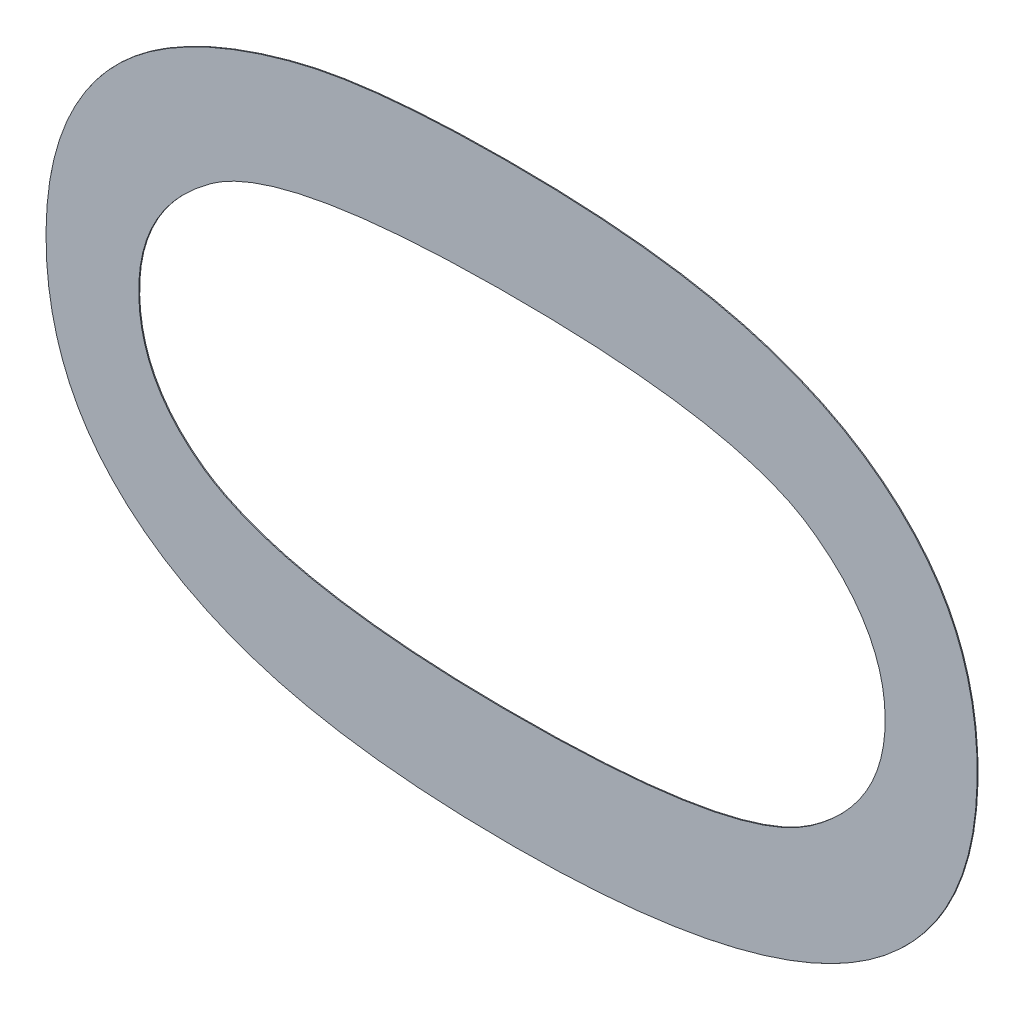
ISO-10303-21;
HEADER;
FILE_DESCRIPTION(('STEP AP214'),'2;1');
FILE_NAME('part.step','',(''),(''),'','','');
FILE_SCHEMA(('AUTOMOTIVE_DESIGN { 1 0 10303 214 1 1 1 1 }'));
ENDSEC;
DATA;
#1=APPLICATION_CONTEXT('core data for automotive mechanical design processes');
#2=APPLICATION_PROTOCOL_DEFINITION('international standard','automotive_design',2000,#1);
#3=PRODUCT_CONTEXT('',#1,'mechanical');
#4=PRODUCT('Part','Part','',(#3));
#5=PRODUCT_RELATED_PRODUCT_CATEGORY('part','',(#4));
#6=PRODUCT_DEFINITION_FORMATION('','',#4);
#7=PRODUCT_DEFINITION_CONTEXT('part definition',#1,'design');
#8=PRODUCT_DEFINITION('design','',#6,#7);
#9=PRODUCT_DEFINITION_SHAPE('','',#8);
#10=(LENGTH_UNIT() NAMED_UNIT(*) SI_UNIT(.MILLI.,.METRE.));
#11=(NAMED_UNIT(*) PLANE_ANGLE_UNIT() SI_UNIT($,.RADIAN.));
#12=(NAMED_UNIT(*) SI_UNIT($,.STERADIAN.) SOLID_ANGLE_UNIT());
#13=UNCERTAINTY_MEASURE_WITH_UNIT(LENGTH_MEASURE(1.E-05),#10,'distance_accuracy_value','');
#14=(GEOMETRIC_REPRESENTATION_CONTEXT(3) GLOBAL_UNCERTAINTY_ASSIGNED_CONTEXT((#13)) GLOBAL_UNIT_ASSIGNED_CONTEXT((#10,
#11,#12)) REPRESENTATION_CONTEXT('',''));
#15=CARTESIAN_POINT('',(0.,0.,0.));
#16=DIRECTION('',(0.,0.,1.));
#17=DIRECTION('',(1.,0.,0.));
#18=AXIS2_PLACEMENT_3D('',#15,#16,#17);
#19=CARTESIAN_POINT('',(50.9692591419545,-9.79446145323658,0.002));
#20=CARTESIAN_POINT('',(50.860466543892,-9.87091219234837,0.002));
#21=CARTESIAN_POINT('',(50.641927562922,-9.90908943221515,0.002));
#22=CARTESIAN_POINT('',(49.9854921219562,-9.90908943221515,0.002));
#23=CARTESIAN_POINT('',(49.7604051565377,-9.86725692470155,0.002));
#24=CARTESIAN_POINT('',(49.6384489461837,-9.78318576882469,0.002));
#25=B_SPLINE_CURVE_WITH_KNOTS('',3,(#19,#20,#21,#22,#23,#24),.UNSPECIFIED.,.F.,.F.,(4,2,4),(0.,
0.207862195038234,0.415724390076468),.UNSPECIFIED.);
#26=DIRECTION('',(0.,0.,-1.));
#27=VECTOR('',#26,1.);
#28=SURFACE_OF_LINEAR_EXTRUSION('',#25,#27);
#29=CARTESIAN_POINT('',(50.9692591419545,-9.79446145323658,0.));
#30=CARTESIAN_POINT('',(50.860466543892,-9.87091219234837,0.));
#31=CARTESIAN_POINT('',(50.641927562922,-9.90908943221515,0.));
#32=CARTESIAN_POINT('',(49.9854921219562,-9.90908943221515,0.));
#33=CARTESIAN_POINT('',(49.7604051565377,-9.86725692470155,0.));
#34=CARTESIAN_POINT('',(49.6384489461837,-9.78318576882469,0.));
#35=B_SPLINE_CURVE_WITH_KNOTS('',3,(#29,#30,#31,#32,#33,#34),.UNSPECIFIED.,.F.,.F.,(4,2,4),(0.,
0.207862195038234,0.415724390076468),.UNSPECIFIED.);
#36=CARTESIAN_POINT('',(50.9692591419545,-9.79446145323658,0.));
#37=VERTEX_POINT('',#36);
#38=CARTESIAN_POINT('',(49.6384489461837,-9.78318576882469,0.));
#39=VERTEX_POINT('',#38);
#40=EDGE_CURVE('E47',#37,#39,#35,.T.);
#41=ORIENTED_EDGE('',*,*,#40,.T.);
#42=DIRECTION('',(0.,0.,-1.));
#43=VECTOR('',#42,1.);
#44=CARTESIAN_POINT('',(49.6384489461837,-9.78318576882469,0.002));
#45=LINE('',#44,#43);
#46=CARTESIAN_POINT('',(49.6384489461837,-9.78318576882469,0.002));
#47=VERTEX_POINT('',#46);
#48=EDGE_CURVE('E52',#47,#39,#45,.T.);
#49=ORIENTED_EDGE('',*,*,#48,.F.);
#50=CARTESIAN_POINT('',(50.9692591419545,-9.79446145323658,0.002));
#51=VERTEX_POINT('',#50);
#52=EDGE_CURVE('E57',#51,#47,#25,.T.);
#53=ORIENTED_EDGE('',*,*,#52,.F.);
#54=DIRECTION('',(0.,0.,-1.));
#55=VECTOR('',#54,1.);
#56=CARTESIAN_POINT('',(50.9692591419545,-9.79446145323658,0.002));
#57=LINE('',#56,#55);
#58=EDGE_CURVE('E59',#37,#51,#57,.F.);
#59=ORIENTED_EDGE('',*,*,#58,.F.);
#60=EDGE_LOOP('',(#41,#49,#53,#59));
#61=FACE_BOUND('',#60,.T.);
#62=ADVANCED_FACE('F17',(#61),#28,.F.);
#63=CARTESIAN_POINT('',(49.7428074483323,-10.0869791243604,0.002));
#64=CARTESIAN_POINT('',(49.8868631062001,-10.1353098854683,0.002));
#65=CARTESIAN_POINT('',(50.0771639042357,-10.1596783364471,0.002));
#66=CARTESIAN_POINT('',(50.6894004501739,-10.1596783364471,0.002));
#67=CARTESIAN_POINT('',(50.9603233067321,-10.094289659654,0.002));
#68=CARTESIAN_POINT('',(51.2653638439467,-9.85404447779484,0.002));
#69=CARTESIAN_POINT('',(51.3339676693268,-9.70358216229394,0.002));
#70=CARTESIAN_POINT('',(51.3339676693268,-9.36689139793687,0.002));
#71=CARTESIAN_POINT('',(51.2946797626356,-9.24667370644146,0.002));
#72=CARTESIAN_POINT('',(51.1373285114931,-9.05635834436053,0.002));
#73=CARTESIAN_POINT('',(51.0262124002455,-8.98471285841936,0.002));
#74=CARTESIAN_POINT('',(50.7377724316794,-8.88902611858838,0.002));
#75=CARTESIAN_POINT('',(50.5482095355023,-8.86530744862325,0.002));
#76=CARTESIAN_POINT('',(50.1156333128709,-8.86530744862325,0.002));
#77=CARTESIAN_POINT('',(49.958072437078,-8.87992851921052,0.002));
#78=CARTESIAN_POINT('',(49.7240792088928,-8.94001240224539,0.002));
#79=CARTESIAN_POINT('',(49.6249437282586,-8.9806514499229,0.002));
#80=CARTESIAN_POINT('',(49.4620626151013,-9.08543578913173,0.002));
#81=CARTESIAN_POINT('',(49.3998567628402,-9.15163674762414,0.002));
#82=CARTESIAN_POINT('',(49.3138232293471,-9.3126392654649,0.002));
#83=CARTESIAN_POINT('',(49.2918150194393,-9.40588091950294,0.002));
#84=CARTESIAN_POINT('',(49.2918150194393,-9.65687596458458,0.002));
#85=CARTESIAN_POINT('',(49.3311029261305,-9.77668751523034,0.002));
#86=CARTESIAN_POINT('',(49.4876354797065,-9.96700389884827,0.002));
#87=CARTESIAN_POINT('',(49.5987517904645,-10.0386483632524,0.002));
#88=CARTESIAN_POINT('',(49.7428074483323,-10.0869791243604,0.002));
#89=B_SPLINE_CURVE_WITH_KNOTS('',3,(#63,#64,#65,#66,#67,#68,#69,#70,#71,#72,#73,#74,#75,#76,#77,
#78,#79,#80,#81,#82,#83,#84,#85,#86,#87,#88),.UNSPECIFIED.,.T.,.F.,(4,2,2,2,2,2,2,2,2,2,2,2,4),
(0.,0.0792605427165015,0.205144934089767,0.309801119705691,0.389348708772571,0.469098391044401,
0.548577661615984,0.615711984402453,0.682790546516745,0.749869108631038,0.817090093922668,
0.908428531952514,1.),.UNSPECIFIED.);
#90=DIRECTION('',(0.,0.,-1.));
#91=VECTOR('',#90,1.);
#92=SURFACE_OF_LINEAR_EXTRUSION('',#89,#91);
#93=CARTESIAN_POINT('',(49.7428074483323,-10.0869791243604,0.002));
#94=VERTEX_POINT('',#93);
#95=EDGE_CURVE('E73',#94,#94,#89,.T.);
#96=ORIENTED_EDGE('',*,*,#95,.F.);
#97=EDGE_LOOP('',(#96));
#98=FACE_BOUND('',#97,.T.);
#99=CARTESIAN_POINT('',(49.7428074483323,-10.0869791243604,0.));
#100=CARTESIAN_POINT('',(49.8868631062001,-10.1353098854683,0.));
#101=CARTESIAN_POINT('',(50.0771639042357,-10.1596783364471,0.));
#102=CARTESIAN_POINT('',(50.6894004501739,-10.1596783364471,0.));
#103=CARTESIAN_POINT('',(50.9603233067321,-10.094289659654,0.));
#104=CARTESIAN_POINT('',(51.2653638439467,-9.85404447779484,0.));
#105=CARTESIAN_POINT('',(51.3339676693268,-9.70358216229394,0.));
#106=CARTESIAN_POINT('',(51.3339676693268,-9.36689139793687,0.));
#107=CARTESIAN_POINT('',(51.2946797626356,-9.24667370644146,0.));
#108=CARTESIAN_POINT('',(51.1373285114931,-9.05635834436053,0.));
#109=CARTESIAN_POINT('',(51.0262124002455,-8.98471285841936,0.));
#110=CARTESIAN_POINT('',(50.7377724316794,-8.88902611858838,0.));
#111=CARTESIAN_POINT('',(50.5482095355023,-8.86530744862325,0.));
#112=CARTESIAN_POINT('',(50.1156333128709,-8.86530744862325,0.));
#113=CARTESIAN_POINT('',(49.958072437078,-8.87992851921052,0.));
#114=CARTESIAN_POINT('',(49.7240792088928,-8.94001240224539,0.));
#115=CARTESIAN_POINT('',(49.6249437282586,-8.9806514499229,0.));
#116=CARTESIAN_POINT('',(49.4620626151013,-9.08543578913173,0.));
#117=CARTESIAN_POINT('',(49.3998567628402,-9.15163674762414,0.));
#118=CARTESIAN_POINT('',(49.3138232293471,-9.3126392654649,0.));
#119=CARTESIAN_POINT('',(49.2918150194393,-9.40588091950294,0.));
#120=CARTESIAN_POINT('',(49.2918150194393,-9.65687596458458,0.));
#121=CARTESIAN_POINT('',(49.3311029261305,-9.77668751523034,0.));
#122=CARTESIAN_POINT('',(49.4876354797065,-9.96700389884827,0.));
#123=CARTESIAN_POINT('',(49.5987517904645,-10.0386483632524,0.));
#124=CARTESIAN_POINT('',(49.7428074483323,-10.0869791243604,0.));
#125=B_SPLINE_CURVE_WITH_KNOTS('',3,(#99,#100,#101,#102,#103,#104,#105,#106,#107,#108,#109,#110,
#111,#112,#113,#114,#115,#116,#117,#118,#119,#120,#121,#122,#123,#124),.UNSPECIFIED.,.T.,.F.,(4,
2,2,2,2,2,2,2,2,2,2,2,4),(0.,0.0792605427165015,0.205144934089767,0.309801119705691,
0.389348708772571,0.469098391044401,0.548577661615984,0.615711984402453,0.682790546516745,
0.749869108631038,0.817090093922668,0.908428531952514,1.),.UNSPECIFIED.);
#126=CARTESIAN_POINT('',(49.7428074483323,-10.0869791243604,0.));
#127=VERTEX_POINT('',#126);
#128=EDGE_CURVE('E49',#127,#127,#125,.T.);
#129=ORIENTED_EDGE('',*,*,#128,.T.);
#130=EDGE_LOOP('',(#129));
#131=FACE_BOUND('',#130,.T.);
#132=ADVANCED_FACE('F85',(#98,#131),#92,.F.);
#133=CARTESIAN_POINT('',(49.6384489461837,-9.78318576882469,0.002));
#134=CARTESIAN_POINT('',(49.5430939226519,-9.71617252863299,0.002));
#135=CARTESIAN_POINT('',(49.495211786372,-9.62682154171073,0.002));
#136=CARTESIAN_POINT('',(49.495211786372,-9.40141337015683,0.002));
#137=CARTESIAN_POINT('',(49.5492326580724,-9.30637641133951,0.002));
#138=CARTESIAN_POINT('',(49.765861193867,-9.1538599725722,0.002));
#139=CARTESIAN_POINT('',(49.9846736239001,-9.11589635285523,0.002));
#140=CARTESIAN_POINT('',(50.641109064866,-9.11589635285523,0.002));
#141=CARTESIAN_POINT('',(50.8592387968078,-9.15366745187237,0.002));
#142=CARTESIAN_POINT('',(51.0777777777778,-9.30637641133951,0.002));
#143=CARTESIAN_POINT('',(51.1322078985062,-9.40060108845754,0.002));
#144=CARTESIAN_POINT('',(51.1322078985062,-9.62438469661285,0.002));
#145=CARTESIAN_POINT('',(51.0777777777778,-9.71820323288122,0.002));
#146=CARTESIAN_POINT('',(50.9692591419545,-9.79446145323658,0.002));
#147=B_SPLINE_CURVE_WITH_KNOTS('',3,(#133,#134,#135,#136,#137,#138,#139,#140,#141,#142,#143,
#144,#145,#146),.UNSPECIFIED.,.F.,.F.,(4,2,2,2,2,2,4),(0.415724390076468,0.511994047386465,
0.610014062102095,0.707786928491968,0.805073362710748,0.902359796929523,1.),.UNSPECIFIED.);
#148=DIRECTION('',(0.,0.,-1.));
#149=VECTOR('',#148,1.);
#150=SURFACE_OF_LINEAR_EXTRUSION('',#147,#149);
#151=CARTESIAN_POINT('',(49.6384489461837,-9.78318576882469,0.));
#152=CARTESIAN_POINT('',(49.5430939226519,-9.71617252863299,0.));
#153=CARTESIAN_POINT('',(49.495211786372,-9.62682154171073,0.));
#154=CARTESIAN_POINT('',(49.495211786372,-9.40141337015683,0.));
#155=CARTESIAN_POINT('',(49.5492326580724,-9.30637641133951,0.));
#156=CARTESIAN_POINT('',(49.765861193867,-9.1538599725722,0.));
#157=CARTESIAN_POINT('',(49.9846736239001,-9.11589635285523,0.));
#158=CARTESIAN_POINT('',(50.641109064866,-9.11589635285523,0.));
#159=CARTESIAN_POINT('',(50.8592387968078,-9.15366745187237,0.));
#160=CARTESIAN_POINT('',(51.0777777777778,-9.30637641133951,0.));
#161=CARTESIAN_POINT('',(51.1322078985062,-9.40060108845754,0.));
#162=CARTESIAN_POINT('',(51.1322078985062,-9.62438469661285,0.));
#163=CARTESIAN_POINT('',(51.0777777777778,-9.71820323288122,0.));
#164=CARTESIAN_POINT('',(50.9692591419545,-9.79446145323658,0.));
#165=B_SPLINE_CURVE_WITH_KNOTS('',3,(#151,#152,#153,#154,#155,#156,#157,#158,#159,#160,#161,
#162,#163,#164),.UNSPECIFIED.,.F.,.F.,(4,2,2,2,2,2,4),(0.415724390076468,0.511994047386465,
0.610014062102095,0.707786928491968,0.805073362710748,0.902359796929523,1.),.UNSPECIFIED.);
#166=EDGE_CURVE('E30',#39,#37,#165,.T.);
#167=ORIENTED_EDGE('',*,*,#166,.T.);
#168=ORIENTED_EDGE('',*,*,#58,.T.);
#169=EDGE_CURVE('E11',#47,#51,#147,.T.);
#170=ORIENTED_EDGE('',*,*,#169,.F.);
#171=ORIENTED_EDGE('',*,*,#48,.T.);
#172=EDGE_LOOP('',(#167,#168,#170,#171));
#173=FACE_BOUND('',#172,.T.);
#174=ADVANCED_FACE('F53',(#173),#150,.F.);
#175=CARTESIAN_POINT('',(50.6931788656966,-8.89196295415249,0.002));
#176=DIRECTION('',(0.,0.,-1.));
#177=DIRECTION('',(-1.,0.,0.));
#178=AXIS2_PLACEMENT_3D('',#175,#176,#177);
#179=PLANE('',#178);
#180=ORIENTED_EDGE('',*,*,#95,.T.);
#181=EDGE_LOOP('',(#180));
#182=FACE_BOUND('',#181,.T.);
#183=ORIENTED_EDGE('',*,*,#52,.T.);
#184=ORIENTED_EDGE('',*,*,#169,.T.);
#185=EDGE_LOOP('',(#183,#184));
#186=FACE_BOUND('',#185,.T.);
#187=ADVANCED_FACE('F90',(#182,#186),#179,.F.);
#188=CARTESIAN_POINT('',(50.6931788656966,-8.89196295415249,0.));
#189=DIRECTION('',(0.,0.,-1.));
#190=DIRECTION('',(-1.,0.,0.));
#191=AXIS2_PLACEMENT_3D('',#188,#189,#190);
#192=PLANE('',#191);
#193=ORIENTED_EDGE('',*,*,#128,.F.);
#194=EDGE_LOOP('',(#193));
#195=FACE_BOUND('',#194,.T.);
#196=ORIENTED_EDGE('',*,*,#40,.F.);
#197=ORIENTED_EDGE('',*,*,#166,.F.);
#198=EDGE_LOOP('',(#196,#197));
#199=FACE_BOUND('',#198,.T.);
#200=ADVANCED_FACE('F19',(#195,#199),#192,.T.);
#201=CLOSED_SHELL('',(#62,#132,#174,#187,#200));
#202=MANIFOLD_SOLID_BREP('B1',#201);
#203=ADVANCED_BREP_SHAPE_REPRESENTATION('',(#18,#202),#14);
#204=SHAPE_DEFINITION_REPRESENTATION(#9,#203);
ENDSEC;
END-ISO-10303-21;
